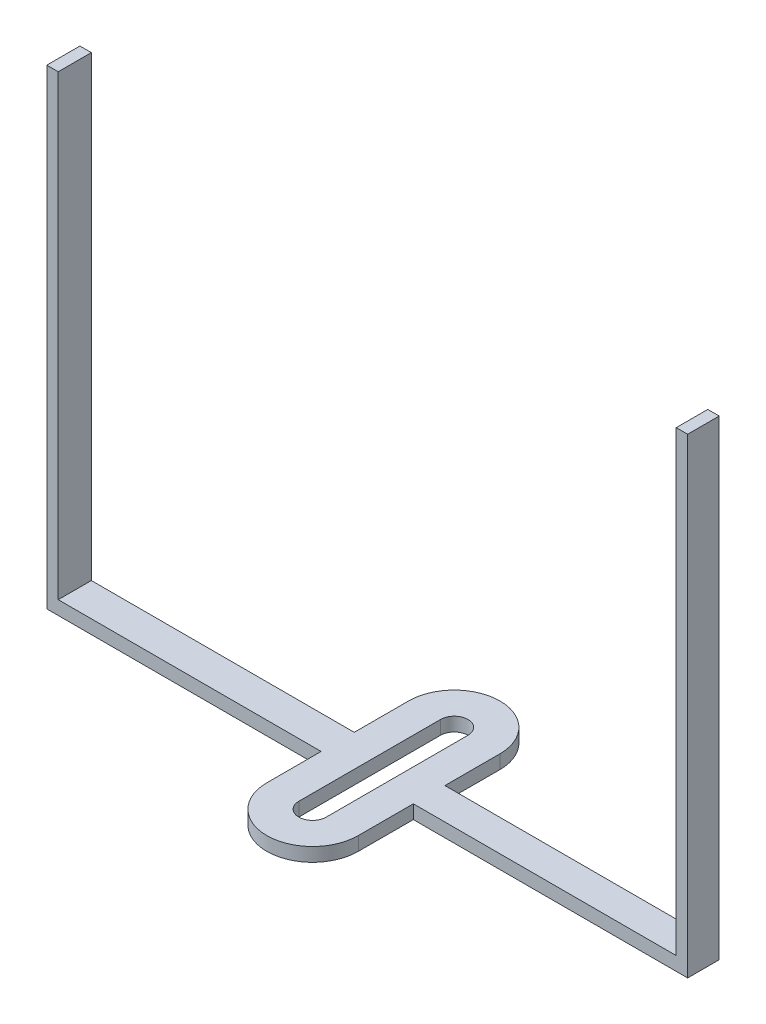
ISO-10303-21;
HEADER;
FILE_DESCRIPTION(('STEP AP214'),'2;1');
FILE_NAME('part.step','',(''),(''),'','','');
FILE_SCHEMA(('AUTOMOTIVE_DESIGN { 1 0 10303 214 1 1 1 1 }'));
ENDSEC;
DATA;
#1=APPLICATION_CONTEXT('core data for automotive mechanical design processes');
#2=APPLICATION_PROTOCOL_DEFINITION('international standard','automotive_design',2000,#1);
#3=PRODUCT_CONTEXT('',#1,'mechanical');
#4=PRODUCT('Part','Part','',(#3));
#5=PRODUCT_RELATED_PRODUCT_CATEGORY('part','',(#4));
#6=PRODUCT_DEFINITION_FORMATION('','',#4);
#7=PRODUCT_DEFINITION_CONTEXT('part definition',#1,'design');
#8=PRODUCT_DEFINITION('design','',#6,#7);
#9=PRODUCT_DEFINITION_SHAPE('','',#8);
#10=(LENGTH_UNIT() NAMED_UNIT(*) SI_UNIT(.MILLI.,.METRE.));
#11=(NAMED_UNIT(*) PLANE_ANGLE_UNIT() SI_UNIT($,.RADIAN.));
#12=(NAMED_UNIT(*) SI_UNIT($,.STERADIAN.) SOLID_ANGLE_UNIT());
#13=UNCERTAINTY_MEASURE_WITH_UNIT(LENGTH_MEASURE(1.E-05),#10,'distance_accuracy_value','');
#14=(GEOMETRIC_REPRESENTATION_CONTEXT(3) GLOBAL_UNCERTAINTY_ASSIGNED_CONTEXT((#13)) GLOBAL_UNIT_ASSIGNED_CONTEXT((#10,
#11,#12)) REPRESENTATION_CONTEXT('',''));
#15=CARTESIAN_POINT('',(0.,0.,0.));
#16=DIRECTION('',(0.,0.,1.));
#17=DIRECTION('',(1.,0.,0.));
#18=AXIS2_PLACEMENT_3D('',#15,#16,#17);
#19=CARTESIAN_POINT('',(0.,3.,-31.));
#20=DIRECTION('',(0.,1.,0.));
#21=DIRECTION('',(0.,0.,1.));
#22=AXIS2_PLACEMENT_3D('',#19,#20,#21);
#23=PLANE('',#22);
#24=DIRECTION('',(0.,0.,-1.));
#25=VECTOR('',#24,1.);
#26=CARTESIAN_POINT('',(2.99999999999999,3.,0.));
#27=LINE('',#26,#25);
#28=CARTESIAN_POINT('',(2.99999999999999,3.,0.));
#29=VERTEX_POINT('',#28);
#30=CARTESIAN_POINT('',(2.99999999999999,3.,-31.));
#31=VERTEX_POINT('',#30);
#32=EDGE_CURVE('E261',#29,#31,#27,.T.);
#33=ORIENTED_EDGE('',*,*,#32,.F.);
#34=CARTESIAN_POINT('',(0.,3.,0.));
#35=DIRECTION('',(0.,1.,0.));
#36=DIRECTION('',(0.,0.,1.));
#37=AXIS2_PLACEMENT_3D('',#34,#35,#36);
#38=CIRCLE('',#37,2.99999999999999);
#39=CARTESIAN_POINT('',(-2.99999999999999,3.,0.));
#40=VERTEX_POINT('',#39);
#41=EDGE_CURVE('E259',#40,#29,#38,.T.);
#42=ORIENTED_EDGE('',*,*,#41,.F.);
#43=DIRECTION('',(0.,0.,1.));
#44=VECTOR('',#43,1.);
#45=CARTESIAN_POINT('',(-2.99999999999999,3.,0.));
#46=LINE('',#45,#44);
#47=CARTESIAN_POINT('',(-2.99999999999999,3.,-31.));
#48=VERTEX_POINT('',#47);
#49=EDGE_CURVE('E267',#48,#40,#46,.T.);
#50=ORIENTED_EDGE('',*,*,#49,.F.);
#51=CARTESIAN_POINT('',(0.,3.,-31.));
#52=DIRECTION('',(0.,1.,0.));
#53=DIRECTION('',(0.,0.,1.));
#54=AXIS2_PLACEMENT_3D('',#51,#52,#53);
#55=CIRCLE('',#54,2.99999999999999);
#56=EDGE_CURVE('E264',#31,#48,#55,.T.);
#57=ORIENTED_EDGE('',*,*,#56,.F.);
#58=EDGE_LOOP('',(#33,#42,#50,#57));
#59=FACE_BOUND('',#58,.T.);
#60=DIRECTION('',(1.,0.,0.));
#61=VECTOR('',#60,1.);
#62=CARTESIAN_POINT('',(-70.,3.,-19.125));
#63=LINE('',#62,#61);
#64=CARTESIAN_POINT('',(-67.5,3.,-19.125));
#65=VERTEX_POINT('',#64);
#66=CARTESIAN_POINT('',(-9.99999999999999,3.,-19.125));
#67=VERTEX_POINT('',#66);
#68=EDGE_CURVE('E233',#65,#67,#63,.T.);
#69=ORIENTED_EDGE('',*,*,#68,.F.);
#70=DIRECTION('',(0.,0.,-1.));
#71=VECTOR('',#70,1.);
#72=CARTESIAN_POINT('',(-67.5,3.,-19.125));
#73=LINE('',#72,#71);
#74=CARTESIAN_POINT('',(-67.5,3.,-11.875));
#75=VERTEX_POINT('',#74);
#76=EDGE_CURVE('E195',#75,#65,#73,.T.);
#77=ORIENTED_EDGE('',*,*,#76,.F.);
#78=DIRECTION('',(1.,0.,0.));
#79=VECTOR('',#78,1.);
#80=CARTESIAN_POINT('',(-70.,3.,-11.875));
#81=LINE('',#80,#79);
#82=CARTESIAN_POINT('',(-9.99999999999999,3.,-11.875));
#83=VERTEX_POINT('',#82);
#84=EDGE_CURVE('E54',#75,#83,#81,.T.);
#85=ORIENTED_EDGE('',*,*,#84,.T.);
#86=DIRECTION('',(0.,0.,1.));
#87=VECTOR('',#86,1.);
#88=CARTESIAN_POINT('',(-9.99999999999999,3.,-31.));
#89=LINE('',#88,#87);
#90=CARTESIAN_POINT('',(-9.99999999999999,3.,0.));
#91=VERTEX_POINT('',#90);
#92=EDGE_CURVE('E293',#83,#91,#89,.T.);
#93=ORIENTED_EDGE('',*,*,#92,.T.);
#94=CARTESIAN_POINT('',(0.,3.,0.));
#95=DIRECTION('',(0.,1.,0.));
#96=DIRECTION('',(0.,0.,1.));
#97=AXIS2_PLACEMENT_3D('',#94,#95,#96);
#98=CIRCLE('',#97,9.99999999999999);
#99=CARTESIAN_POINT('',(9.99999999999999,3.,0.));
#100=VERTEX_POINT('',#99);
#101=EDGE_CURVE('E298',#91,#100,#98,.T.);
#102=ORIENTED_EDGE('',*,*,#101,.T.);
#103=DIRECTION('',(0.,0.,-1.));
#104=VECTOR('',#103,1.);
#105=CARTESIAN_POINT('',(9.99999999999999,3.,-31.));
#106=LINE('',#105,#104);
#107=CARTESIAN_POINT('',(9.99999999999999,3.,-12.0483562662711));
#108=VERTEX_POINT('',#107);
#109=EDGE_CURVE('E301',#100,#108,#106,.T.);
#110=ORIENTED_EDGE('',*,*,#109,.T.);
#111=DIRECTION('',(-1.,0.,0.));
#112=VECTOR('',#111,1.);
#113=CARTESIAN_POINT('',(70.,3.,-12.0483562662711));
#114=LINE('',#113,#112);
#115=CARTESIAN_POINT('',(67.5,3.,-12.0483562662711));
#116=VERTEX_POINT('',#115);
#117=EDGE_CURVE('E254',#116,#108,#114,.T.);
#118=ORIENTED_EDGE('',*,*,#117,.F.);
#119=DIRECTION('',(0.,0.,1.));
#120=VECTOR('',#119,1.);
#121=CARTESIAN_POINT('',(67.5,3.,-18.9516437337289));
#122=LINE('',#121,#120);
#123=CARTESIAN_POINT('',(67.5,3.,-18.9516437337289));
#124=VERTEX_POINT('',#123);
#125=EDGE_CURVE('E47',#124,#116,#122,.T.);
#126=ORIENTED_EDGE('',*,*,#125,.F.);
#127=DIRECTION('',(-1.,0.,0.));
#128=VECTOR('',#127,1.);
#129=CARTESIAN_POINT('',(70.,3.,-18.9516437337289));
#130=LINE('',#129,#128);
#131=CARTESIAN_POINT('',(9.99999999999999,3.,-18.9516437337289));
#132=VERTEX_POINT('',#131);
#133=EDGE_CURVE('E256',#124,#132,#130,.T.);
#134=ORIENTED_EDGE('',*,*,#133,.T.);
#135=CARTESIAN_POINT('',(9.99999999999999,3.,-31.));
#136=VERTEX_POINT('',#135);
#137=EDGE_CURVE('E300',#132,#136,#106,.T.);
#138=ORIENTED_EDGE('',*,*,#137,.T.);
#139=CARTESIAN_POINT('',(0.,3.,-31.));
#140=DIRECTION('',(0.,1.,0.));
#141=DIRECTION('',(0.,0.,1.));
#142=AXIS2_PLACEMENT_3D('',#139,#140,#141);
#143=CIRCLE('',#142,9.99999999999999);
#144=CARTESIAN_POINT('',(-9.99999999999999,3.,-31.));
#145=VERTEX_POINT('',#144);
#146=EDGE_CURVE('E290',#136,#145,#143,.T.);
#147=ORIENTED_EDGE('',*,*,#146,.T.);
#148=EDGE_CURVE('E295',#145,#67,#89,.T.);
#149=ORIENTED_EDGE('',*,*,#148,.T.);
#150=EDGE_LOOP('',(#69,#77,#85,#93,#102,#110,#118,#126,#134,#138,#147,#149));
#151=FACE_BOUND('',#150,.T.);
#152=ADVANCED_FACE('F32',(#59,#151),#23,.T.);
#153=CARTESIAN_POINT('',(-9.99999999999999,3.,-31.));
#154=DIRECTION('',(1.,0.,0.));
#155=DIRECTION('',(0.,0.,-1.));
#156=AXIS2_PLACEMENT_3D('',#153,#154,#155);
#157=PLANE('',#156);
#158=DIRECTION('',(0.,1.,0.));
#159=VECTOR('',#158,1.);
#160=CARTESIAN_POINT('',(-9.99999999999999,0.,-11.875));
#161=LINE('',#160,#159);
#162=CARTESIAN_POINT('',(-9.99999999999999,0.,-11.875));
#163=VERTEX_POINT('',#162);
#164=EDGE_CURVE('E221',#163,#83,#161,.T.);
#165=ORIENTED_EDGE('',*,*,#164,.F.);
#166=DIRECTION('',(0.,0.,1.));
#167=VECTOR('',#166,1.);
#168=CARTESIAN_POINT('',(-9.99999999999999,0.,-31.));
#169=LINE('',#168,#167);
#170=CARTESIAN_POINT('',(-9.99999999999999,0.,0.));
#171=VERTEX_POINT('',#170);
#172=EDGE_CURVE('E307',#163,#171,#169,.T.);
#173=ORIENTED_EDGE('',*,*,#172,.T.);
#174=DIRECTION('',(0.,-1.,0.));
#175=VECTOR('',#174,1.);
#176=CARTESIAN_POINT('',(-9.99999999999999,3.,0.));
#177=LINE('',#176,#175);
#178=EDGE_CURVE('E40',#91,#171,#177,.T.);
#179=ORIENTED_EDGE('',*,*,#178,.F.);
#180=ORIENTED_EDGE('',*,*,#92,.F.);
#181=EDGE_LOOP('',(#165,#173,#179,#180));
#182=FACE_BOUND('',#181,.T.);
#183=ADVANCED_FACE('F365',(#182),#157,.F.);
#184=DIRECTION('',(0.,-1.,0.));
#185=VECTOR('',#184,1.);
#186=CARTESIAN_POINT('',(-9.99999999999999,0.,-19.125));
#187=LINE('',#186,#185);
#188=CARTESIAN_POINT('',(-9.99999999999999,0.,-19.125));
#189=VERTEX_POINT('',#188);
#190=EDGE_CURVE('E180',#67,#189,#187,.T.);
#191=ORIENTED_EDGE('',*,*,#190,.F.);
#192=ORIENTED_EDGE('',*,*,#148,.F.);
#193=DIRECTION('',(0.,-1.,0.));
#194=VECTOR('',#193,1.);
#195=CARTESIAN_POINT('',(-9.99999999999999,3.,-31.));
#196=LINE('',#195,#194);
#197=CARTESIAN_POINT('',(-9.99999999999999,0.,-31.));
#198=VERTEX_POINT('',#197);
#199=EDGE_CURVE('E11',#145,#198,#196,.T.);
#200=ORIENTED_EDGE('',*,*,#199,.T.);
#201=EDGE_CURVE('E308',#198,#189,#169,.T.);
#202=ORIENTED_EDGE('',*,*,#201,.T.);
#203=EDGE_LOOP('',(#191,#192,#200,#202));
#204=FACE_BOUND('',#203,.T.);
#205=ADVANCED_FACE('F361',(#204),#157,.F.);
#206=CARTESIAN_POINT('',(9.99999999999999,3.,-31.));
#207=DIRECTION('',(-1.,0.,0.));
#208=DIRECTION('',(0.,0.,1.));
#209=AXIS2_PLACEMENT_3D('',#206,#207,#208);
#210=PLANE('',#209);
#211=DIRECTION('',(0.,1.,0.));
#212=VECTOR('',#211,1.);
#213=CARTESIAN_POINT('',(9.99999999999999,3.,-18.9516437337289));
#214=LINE('',#213,#212);
#215=CARTESIAN_POINT('',(9.99999999999999,0.,-18.9516437337289));
#216=VERTEX_POINT('',#215);
#217=EDGE_CURVE('E236',#216,#132,#214,.T.);
#218=ORIENTED_EDGE('',*,*,#217,.F.);
#219=DIRECTION('',(0.,0.,-1.));
#220=VECTOR('',#219,1.);
#221=CARTESIAN_POINT('',(9.99999999999999,0.,-31.));
#222=LINE('',#221,#220);
#223=CARTESIAN_POINT('',(9.99999999999999,0.,-31.));
#224=VERTEX_POINT('',#223);
#225=EDGE_CURVE('E312',#216,#224,#222,.T.);
#226=ORIENTED_EDGE('',*,*,#225,.T.);
#227=DIRECTION('',(0.,-1.,0.));
#228=VECTOR('',#227,1.);
#229=CARTESIAN_POINT('',(9.99999999999999,3.,-31.));
#230=LINE('',#229,#228);
#231=EDGE_CURVE('E304',#136,#224,#230,.T.);
#232=ORIENTED_EDGE('',*,*,#231,.F.);
#233=ORIENTED_EDGE('',*,*,#137,.F.);
#234=EDGE_LOOP('',(#218,#226,#232,#233));
#235=FACE_BOUND('',#234,.T.);
#236=ADVANCED_FACE('F355',(#235),#210,.F.);
#237=DIRECTION('',(0.,-1.,0.));
#238=VECTOR('',#237,1.);
#239=CARTESIAN_POINT('',(9.99999999999999,3.,-12.0483562662711));
#240=LINE('',#239,#238);
#241=CARTESIAN_POINT('',(9.99999999999999,0.,-12.0483562662711));
#242=VERTEX_POINT('',#241);
#243=EDGE_CURVE('E240',#108,#242,#240,.T.);
#244=ORIENTED_EDGE('',*,*,#243,.F.);
#245=ORIENTED_EDGE('',*,*,#109,.F.);
#246=DIRECTION('',(0.,-1.,0.));
#247=VECTOR('',#246,1.);
#248=CARTESIAN_POINT('',(9.99999999999999,3.,0.));
#249=LINE('',#248,#247);
#250=CARTESIAN_POINT('',(9.99999999999999,0.,0.));
#251=VERTEX_POINT('',#250);
#252=EDGE_CURVE('E316',#100,#251,#249,.T.);
#253=ORIENTED_EDGE('',*,*,#252,.T.);
#254=EDGE_CURVE('E294',#251,#242,#222,.T.);
#255=ORIENTED_EDGE('',*,*,#254,.T.);
#256=EDGE_LOOP('',(#244,#245,#253,#255));
#257=FACE_BOUND('',#256,.T.);
#258=ADVANCED_FACE('F336',(#257),#210,.F.);
#259=CARTESIAN_POINT('',(0.,0.,-31.));
#260=DIRECTION('',(0.,1.,0.));
#261=DIRECTION('',(0.,0.,1.));
#262=AXIS2_PLACEMENT_3D('',#259,#260,#261);
#263=PLANE('',#262);
#264=CARTESIAN_POINT('',(0.,0.,-31.));
#265=DIRECTION('',(0.,1.,0.));
#266=DIRECTION('',(0.,0.,1.));
#267=AXIS2_PLACEMENT_3D('',#264,#265,#266);
#268=CIRCLE('',#267,9.99999999999999);
#269=EDGE_CURVE('E289',#224,#198,#268,.T.);
#270=ORIENTED_EDGE('',*,*,#269,.F.);
#271=ORIENTED_EDGE('',*,*,#225,.F.);
#272=DIRECTION('',(-1.,0.,0.));
#273=VECTOR('',#272,1.);
#274=CARTESIAN_POINT('',(70.,0.,-18.9516437337289));
#275=LINE('',#274,#273);
#276=CARTESIAN_POINT('',(70.,0.,-18.9516437337289));
#277=VERTEX_POINT('',#276);
#278=EDGE_CURVE('E244',#277,#216,#275,.T.);
#279=ORIENTED_EDGE('',*,*,#278,.F.);
#280=DIRECTION('',(0.,0.,-1.));
#281=VECTOR('',#280,1.);
#282=CARTESIAN_POINT('',(70.,0.,-18.9516437337289));
#283=LINE('',#282,#281);
#284=CARTESIAN_POINT('',(70.,0.,-12.0483562662711));
#285=VERTEX_POINT('',#284);
#286=EDGE_CURVE('E242',#285,#277,#283,.T.);
#287=ORIENTED_EDGE('',*,*,#286,.F.);
#288=DIRECTION('',(-1.,0.,0.));
#289=VECTOR('',#288,1.);
#290=CARTESIAN_POINT('',(70.,0.,-12.0483562662711));
#291=LINE('',#290,#289);
#292=EDGE_CURVE('E251',#285,#242,#291,.T.);
#293=ORIENTED_EDGE('',*,*,#292,.T.);
#294=ORIENTED_EDGE('',*,*,#254,.F.);
#295=CARTESIAN_POINT('',(0.,0.,0.));
#296=DIRECTION('',(0.,1.,0.));
#297=DIRECTION('',(0.,0.,1.));
#298=AXIS2_PLACEMENT_3D('',#295,#296,#297);
#299=CIRCLE('',#298,9.99999999999999);
#300=EDGE_CURVE('E310',#171,#251,#299,.T.);
#301=ORIENTED_EDGE('',*,*,#300,.F.);
#302=ORIENTED_EDGE('',*,*,#172,.F.);
#303=DIRECTION('',(1.,0.,0.));
#304=VECTOR('',#303,1.);
#305=CARTESIAN_POINT('',(-70.,0.,-11.875));
#306=LINE('',#305,#304);
#307=CARTESIAN_POINT('',(-70.,0.,-11.875));
#308=VERTEX_POINT('',#307);
#309=EDGE_CURVE('E225',#308,#163,#306,.T.);
#310=ORIENTED_EDGE('',*,*,#309,.F.);
#311=DIRECTION('',(0.,0.,1.));
#312=VECTOR('',#311,1.);
#313=CARTESIAN_POINT('',(-70.,0.,-11.875));
#314=LINE('',#313,#312);
#315=CARTESIAN_POINT('',(-70.,0.,-19.125));
#316=VERTEX_POINT('',#315);
#317=EDGE_CURVE('E175',#316,#308,#314,.T.);
#318=ORIENTED_EDGE('',*,*,#317,.F.);
#319=DIRECTION('',(1.,0.,0.));
#320=VECTOR('',#319,1.);
#321=CARTESIAN_POINT('',(-70.,0.,-19.125));
#322=LINE('',#321,#320);
#323=EDGE_CURVE('E230',#316,#189,#322,.T.);
#324=ORIENTED_EDGE('',*,*,#323,.T.);
#325=ORIENTED_EDGE('',*,*,#201,.F.);
#326=EDGE_LOOP('',(#270,#271,#279,#287,#293,#294,#301,#302,#310,#318,#324,#325));
#327=FACE_BOUND('',#326,.T.);
#328=CARTESIAN_POINT('',(0.,0.,0.));
#329=DIRECTION('',(0.,1.,0.));
#330=DIRECTION('',(0.,0.,1.));
#331=AXIS2_PLACEMENT_3D('',#328,#329,#330);
#332=CIRCLE('',#331,2.99999999999999);
#333=CARTESIAN_POINT('',(-2.99999999999999,0.,0.));
#334=VERTEX_POINT('',#333);
#335=CARTESIAN_POINT('',(2.99999999999999,0.,0.));
#336=VERTEX_POINT('',#335);
#337=EDGE_CURVE('E258',#334,#336,#332,.T.);
#338=ORIENTED_EDGE('',*,*,#337,.T.);
#339=DIRECTION('',(0.,0.,-1.));
#340=VECTOR('',#339,1.);
#341=CARTESIAN_POINT('',(2.99999999999999,0.,0.));
#342=LINE('',#341,#340);
#343=CARTESIAN_POINT('',(2.99999999999999,0.,-31.));
#344=VERTEX_POINT('',#343);
#345=EDGE_CURVE('E272',#336,#344,#342,.T.);
#346=ORIENTED_EDGE('',*,*,#345,.T.);
#347=CARTESIAN_POINT('',(0.,0.,-31.));
#348=DIRECTION('',(0.,1.,0.));
#349=DIRECTION('',(0.,0.,1.));
#350=AXIS2_PLACEMENT_3D('',#347,#348,#349);
#351=CIRCLE('',#350,2.99999999999999);
#352=CARTESIAN_POINT('',(-2.99999999999999,0.,-31.));
#353=VERTEX_POINT('',#352);
#354=EDGE_CURVE('E275',#344,#353,#351,.T.);
#355=ORIENTED_EDGE('',*,*,#354,.T.);
#356=DIRECTION('',(0.,0.,1.));
#357=VECTOR('',#356,1.);
#358=CARTESIAN_POINT('',(-2.99999999999999,0.,0.));
#359=LINE('',#358,#357);
#360=EDGE_CURVE('E262',#353,#334,#359,.T.);
#361=ORIENTED_EDGE('',*,*,#360,.T.);
#362=EDGE_LOOP('',(#338,#346,#355,#361));
#363=FACE_BOUND('',#362,.T.);
#364=ADVANCED_FACE('F329',(#327,#363),#263,.F.);
#365=CARTESIAN_POINT('',(0.,3.,-31.));
#366=DIRECTION('',(0.,-1.,0.));
#367=DIRECTION('',(0.,0.,-1.));
#368=AXIS2_PLACEMENT_3D('',#365,#366,#367);
#369=CYLINDRICAL_SURFACE('',#368,9.99999999999999);
#370=ORIENTED_EDGE('',*,*,#269,.T.);
#371=ORIENTED_EDGE('',*,*,#199,.F.);
#372=ORIENTED_EDGE('',*,*,#146,.F.);
#373=ORIENTED_EDGE('',*,*,#231,.T.);
#374=EDGE_LOOP('',(#370,#371,#372,#373));
#375=FACE_BOUND('',#374,.T.);
#376=ADVANCED_FACE('F34',(#375),#369,.T.);
#377=CARTESIAN_POINT('',(0.,3.,0.));
#378=DIRECTION('',(0.,-1.,0.));
#379=DIRECTION('',(0.,0.,-1.));
#380=AXIS2_PLACEMENT_3D('',#377,#378,#379);
#381=CYLINDRICAL_SURFACE('',#380,9.99999999999999);
#382=ORIENTED_EDGE('',*,*,#300,.T.);
#383=ORIENTED_EDGE('',*,*,#252,.F.);
#384=ORIENTED_EDGE('',*,*,#101,.F.);
#385=ORIENTED_EDGE('',*,*,#178,.T.);
#386=EDGE_LOOP('',(#382,#383,#384,#385));
#387=FACE_BOUND('',#386,.T.);
#388=ADVANCED_FACE('F323',(#387),#381,.T.);
#389=CARTESIAN_POINT('',(0.,3.,0.));
#390=DIRECTION('',(0.,-1.,0.));
#391=DIRECTION('',(0.,0.,-1.));
#392=AXIS2_PLACEMENT_3D('',#389,#390,#391);
#393=CYLINDRICAL_SURFACE('',#392,2.99999999999999);
#394=ORIENTED_EDGE('',*,*,#337,.F.);
#395=DIRECTION('',(0.,-1.,0.));
#396=VECTOR('',#395,1.);
#397=CARTESIAN_POINT('',(-2.99999999999999,3.,0.));
#398=LINE('',#397,#396);
#399=EDGE_CURVE('E269',#40,#334,#398,.T.);
#400=ORIENTED_EDGE('',*,*,#399,.F.);
#401=ORIENTED_EDGE('',*,*,#41,.T.);
#402=DIRECTION('',(0.,-1.,0.));
#403=VECTOR('',#402,1.);
#404=CARTESIAN_POINT('',(2.99999999999999,3.,0.));
#405=LINE('',#404,#403);
#406=EDGE_CURVE('E286',#29,#336,#405,.T.);
#407=ORIENTED_EDGE('',*,*,#406,.T.);
#408=EDGE_LOOP('',(#394,#400,#401,#407));
#409=FACE_BOUND('',#408,.T.);
#410=ADVANCED_FACE('F377',(#409),#393,.F.);
#411=CARTESIAN_POINT('',(2.99999999999999,3.,0.));
#412=DIRECTION('',(-1.,0.,0.));
#413=DIRECTION('',(0.,0.,1.));
#414=AXIS2_PLACEMENT_3D('',#411,#412,#413);
#415=PLANE('',#414);
#416=ORIENTED_EDGE('',*,*,#345,.F.);
#417=ORIENTED_EDGE('',*,*,#406,.F.);
#418=ORIENTED_EDGE('',*,*,#32,.T.);
#419=DIRECTION('',(0.,-1.,0.));
#420=VECTOR('',#419,1.);
#421=CARTESIAN_POINT('',(2.99999999999999,3.,-31.));
#422=LINE('',#421,#420);
#423=EDGE_CURVE('E284',#31,#344,#422,.T.);
#424=ORIENTED_EDGE('',*,*,#423,.T.);
#425=EDGE_LOOP('',(#416,#417,#418,#424));
#426=FACE_BOUND('',#425,.T.);
#427=ADVANCED_FACE('F384',(#426),#415,.T.);
#428=CARTESIAN_POINT('',(0.,3.,-31.));
#429=DIRECTION('',(0.,-1.,0.));
#430=DIRECTION('',(0.,0.,-1.));
#431=AXIS2_PLACEMENT_3D('',#428,#429,#430);
#432=CYLINDRICAL_SURFACE('',#431,2.99999999999999);
#433=ORIENTED_EDGE('',*,*,#354,.F.);
#434=ORIENTED_EDGE('',*,*,#423,.F.);
#435=ORIENTED_EDGE('',*,*,#56,.T.);
#436=DIRECTION('',(0.,-1.,0.));
#437=VECTOR('',#436,1.);
#438=CARTESIAN_POINT('',(-2.99999999999999,3.,-31.));
#439=LINE('',#438,#437);
#440=EDGE_CURVE('E282',#48,#353,#439,.T.);
#441=ORIENTED_EDGE('',*,*,#440,.T.);
#442=EDGE_LOOP('',(#433,#434,#435,#441));
#443=FACE_BOUND('',#442,.T.);
#444=ADVANCED_FACE('F388',(#443),#432,.F.);
#445=CARTESIAN_POINT('',(-2.99999999999999,3.,0.));
#446=DIRECTION('',(1.,0.,0.));
#447=DIRECTION('',(0.,0.,-1.));
#448=AXIS2_PLACEMENT_3D('',#445,#446,#447);
#449=PLANE('',#448);
#450=ORIENTED_EDGE('',*,*,#360,.F.);
#451=ORIENTED_EDGE('',*,*,#440,.F.);
#452=ORIENTED_EDGE('',*,*,#49,.T.);
#453=ORIENTED_EDGE('',*,*,#399,.T.);
#454=EDGE_LOOP('',(#450,#451,#452,#453));
#455=FACE_BOUND('',#454,.T.);
#456=ADVANCED_FACE('F392',(#455),#449,.T.);
#457=CARTESIAN_POINT('',(70.,3.,-18.9516437337289));
#458=DIRECTION('',(0.,0.,1.));
#459=DIRECTION('',(1.,0.,0.));
#460=AXIS2_PLACEMENT_3D('',#457,#458,#459);
#461=PLANE('',#460);
#462=ORIENTED_EDGE('',*,*,#217,.T.);
#463=ORIENTED_EDGE('',*,*,#133,.F.);
#464=DIRECTION('',(0.,-1.,0.));
#465=VECTOR('',#464,1.);
#466=CARTESIAN_POINT('',(67.5,103.,-18.9516437337289));
#467=LINE('',#466,#465);
#468=CARTESIAN_POINT('',(67.5,103.,-18.9516437337289));
#469=VERTEX_POINT('',#468);
#470=EDGE_CURVE('E219',#469,#124,#467,.T.);
#471=ORIENTED_EDGE('',*,*,#470,.F.);
#472=DIRECTION('',(-1.,0.,0.));
#473=VECTOR('',#472,1.);
#474=CARTESIAN_POINT('',(70.,103.,-18.9516437337289));
#475=LINE('',#474,#473);
#476=CARTESIAN_POINT('',(70.,103.,-18.9516437337289));
#477=VERTEX_POINT('',#476);
#478=EDGE_CURVE('E208',#477,#469,#475,.T.);
#479=ORIENTED_EDGE('',*,*,#478,.F.);
#480=DIRECTION('',(0.,1.,0.));
#481=VECTOR('',#480,1.);
#482=CARTESIAN_POINT('',(70.,3.,-18.9516437337289));
#483=LINE('',#482,#481);
#484=EDGE_CURVE('E237',#277,#477,#483,.T.);
#485=ORIENTED_EDGE('',*,*,#484,.F.);
#486=ORIENTED_EDGE('',*,*,#278,.T.);
#487=EDGE_LOOP('',(#462,#463,#471,#479,#485,#486));
#488=FACE_BOUND('',#487,.T.);
#489=ADVANCED_FACE('F349',(#488),#461,.F.);
#490=CARTESIAN_POINT('',(70.,3.,-12.0483562662711));
#491=DIRECTION('',(0.,0.,-1.));
#492=DIRECTION('',(0.,1.,0.));
#493=AXIS2_PLACEMENT_3D('',#490,#491,#492);
#494=PLANE('',#493);
#495=ORIENTED_EDGE('',*,*,#243,.T.);
#496=ORIENTED_EDGE('',*,*,#292,.F.);
#497=DIRECTION('',(0.,-1.,0.));
#498=VECTOR('',#497,1.);
#499=CARTESIAN_POINT('',(70.,3.,-12.0483562662711));
#500=LINE('',#499,#498);
#501=CARTESIAN_POINT('',(70.,103.,-12.0483562662711));
#502=VERTEX_POINT('',#501);
#503=EDGE_CURVE('E239',#502,#285,#500,.T.);
#504=ORIENTED_EDGE('',*,*,#503,.F.);
#505=DIRECTION('',(1.,0.,0.));
#506=VECTOR('',#505,1.);
#507=CARTESIAN_POINT('',(70.,103.,-12.0483562662711));
#508=LINE('',#507,#506);
#509=CARTESIAN_POINT('',(67.5,103.,-12.0483562662711));
#510=VERTEX_POINT('',#509);
#511=EDGE_CURVE('E212',#510,#502,#508,.T.);
#512=ORIENTED_EDGE('',*,*,#511,.F.);
#513=DIRECTION('',(0.,-1.,0.));
#514=VECTOR('',#513,1.);
#515=CARTESIAN_POINT('',(67.5,103.,-12.0483562662711));
#516=LINE('',#515,#514);
#517=EDGE_CURVE('E215',#510,#116,#516,.T.);
#518=ORIENTED_EDGE('',*,*,#517,.T.);
#519=ORIENTED_EDGE('',*,*,#117,.T.);
#520=EDGE_LOOP('',(#495,#496,#504,#512,#518,#519));
#521=FACE_BOUND('',#520,.T.);
#522=ADVANCED_FACE('F339',(#521),#494,.F.);
#523=CARTESIAN_POINT('',(70.,0.,0.));
#524=DIRECTION('',(-1.,0.,0.));
#525=DIRECTION('',(0.,0.,1.));
#526=AXIS2_PLACEMENT_3D('',#523,#524,#525);
#527=PLANE('',#526);
#528=ORIENTED_EDGE('',*,*,#484,.T.);
#529=DIRECTION('',(0.,0.,-1.));
#530=VECTOR('',#529,1.);
#531=CARTESIAN_POINT('',(70.,103.,-18.9516437337289));
#532=LINE('',#531,#530);
#533=EDGE_CURVE('E205',#502,#477,#532,.T.);
#534=ORIENTED_EDGE('',*,*,#533,.F.);
#535=ORIENTED_EDGE('',*,*,#503,.T.);
#536=ORIENTED_EDGE('',*,*,#286,.T.);
#537=EDGE_LOOP('',(#528,#534,#535,#536));
#538=FACE_BOUND('',#537,.T.);
#539=ADVANCED_FACE('F401',(#538),#527,.F.);
#540=CARTESIAN_POINT('',(-70.,0.,-11.875));
#541=DIRECTION('',(0.,0.,-1.));
#542=DIRECTION('',(-1.,0.,0.));
#543=AXIS2_PLACEMENT_3D('',#540,#541,#542);
#544=PLANE('',#543);
#545=ORIENTED_EDGE('',*,*,#164,.T.);
#546=ORIENTED_EDGE('',*,*,#84,.F.);
#547=DIRECTION('',(0.,-1.,0.));
#548=VECTOR('',#547,1.);
#549=CARTESIAN_POINT('',(-67.5,103.,-11.875));
#550=LINE('',#549,#548);
#551=CARTESIAN_POINT('',(-67.5,103.,-11.875));
#552=VERTEX_POINT('',#551);
#553=EDGE_CURVE('E186',#552,#75,#550,.T.);
#554=ORIENTED_EDGE('',*,*,#553,.F.);
#555=DIRECTION('',(1.,0.,0.));
#556=VECTOR('',#555,1.);
#557=CARTESIAN_POINT('',(-70.,103.,-11.875));
#558=LINE('',#557,#556);
#559=CARTESIAN_POINT('',(-70.,103.,-11.875));
#560=VERTEX_POINT('',#559);
#561=EDGE_CURVE('E183',#560,#552,#558,.T.);
#562=ORIENTED_EDGE('',*,*,#561,.F.);
#563=DIRECTION('',(0.,1.,0.));
#564=VECTOR('',#563,1.);
#565=CARTESIAN_POINT('',(-70.,0.,-11.875));
#566=LINE('',#565,#564);
#567=EDGE_CURVE('E169',#308,#560,#566,.T.);
#568=ORIENTED_EDGE('',*,*,#567,.F.);
#569=ORIENTED_EDGE('',*,*,#309,.T.);
#570=EDGE_LOOP('',(#545,#546,#554,#562,#568,#569));
#571=FACE_BOUND('',#570,.T.);
#572=ADVANCED_FACE('F185',(#571),#544,.F.);
#573=CARTESIAN_POINT('',(-70.,0.,-19.125));
#574=DIRECTION('',(0.,0.,1.));
#575=DIRECTION('',(1.,0.,0.));
#576=AXIS2_PLACEMENT_3D('',#573,#574,#575);
#577=PLANE('',#576);
#578=ORIENTED_EDGE('',*,*,#190,.T.);
#579=ORIENTED_EDGE('',*,*,#323,.F.);
#580=DIRECTION('',(0.,-1.,0.));
#581=VECTOR('',#580,1.);
#582=CARTESIAN_POINT('',(-70.,0.,-19.125));
#583=LINE('',#582,#581);
#584=CARTESIAN_POINT('',(-70.,103.,-19.125));
#585=VERTEX_POINT('',#584);
#586=EDGE_CURVE('E179',#585,#316,#583,.T.);
#587=ORIENTED_EDGE('',*,*,#586,.F.);
#588=DIRECTION('',(-1.,0.,0.));
#589=VECTOR('',#588,1.);
#590=CARTESIAN_POINT('',(-70.,103.,-19.125));
#591=LINE('',#590,#589);
#592=CARTESIAN_POINT('',(-67.5,103.,-19.125));
#593=VERTEX_POINT('',#592);
#594=EDGE_CURVE('E194',#593,#585,#591,.T.);
#595=ORIENTED_EDGE('',*,*,#594,.F.);
#596=DIRECTION('',(0.,-1.,0.));
#597=VECTOR('',#596,1.);
#598=CARTESIAN_POINT('',(-67.5,103.,-19.125));
#599=LINE('',#598,#597);
#600=EDGE_CURVE('E200',#593,#65,#599,.T.);
#601=ORIENTED_EDGE('',*,*,#600,.T.);
#602=ORIENTED_EDGE('',*,*,#68,.T.);
#603=EDGE_LOOP('',(#578,#579,#587,#595,#601,#602));
#604=FACE_BOUND('',#603,.T.);
#605=ADVANCED_FACE('F364',(#604),#577,.F.);
#606=CARTESIAN_POINT('',(-70.,0.,0.));
#607=DIRECTION('',(-1.,0.,0.));
#608=DIRECTION('',(0.,0.,1.));
#609=AXIS2_PLACEMENT_3D('',#606,#607,#608);
#610=PLANE('',#609);
#611=ORIENTED_EDGE('',*,*,#567,.T.);
#612=DIRECTION('',(0.,0.,1.));
#613=VECTOR('',#612,1.);
#614=CARTESIAN_POINT('',(-70.,103.,-19.125));
#615=LINE('',#614,#613);
#616=EDGE_CURVE('E173',#585,#560,#615,.T.);
#617=ORIENTED_EDGE('',*,*,#616,.F.);
#618=ORIENTED_EDGE('',*,*,#586,.T.);
#619=ORIENTED_EDGE('',*,*,#317,.T.);
#620=EDGE_LOOP('',(#611,#617,#618,#619));
#621=FACE_BOUND('',#620,.T.);
#622=ADVANCED_FACE('F171',(#621),#610,.T.);
#623=CARTESIAN_POINT('',(67.5,103.,-18.9516437337289));
#624=DIRECTION('',(1.,0.,0.));
#625=DIRECTION('',(0.,0.,-1.));
#626=AXIS2_PLACEMENT_3D('',#623,#624,#625);
#627=PLANE('',#626);
#628=ORIENTED_EDGE('',*,*,#125,.T.);
#629=ORIENTED_EDGE('',*,*,#517,.F.);
#630=DIRECTION('',(0.,0.,1.));
#631=VECTOR('',#630,1.);
#632=CARTESIAN_POINT('',(67.5,103.,-18.9516437337289));
#633=LINE('',#632,#631);
#634=EDGE_CURVE('E210',#469,#510,#633,.T.);
#635=ORIENTED_EDGE('',*,*,#634,.F.);
#636=ORIENTED_EDGE('',*,*,#470,.T.);
#637=EDGE_LOOP('',(#628,#629,#635,#636));
#638=FACE_BOUND('',#637,.T.);
#639=ADVANCED_FACE('F344',(#638),#627,.F.);
#640=CARTESIAN_POINT('',(0.,103.,0.));
#641=DIRECTION('',(0.,-1.,0.));
#642=DIRECTION('',(0.,0.,-1.));
#643=AXIS2_PLACEMENT_3D('',#640,#641,#642);
#644=PLANE('',#643);
#645=ORIENTED_EDGE('',*,*,#533,.T.);
#646=ORIENTED_EDGE('',*,*,#478,.T.);
#647=ORIENTED_EDGE('',*,*,#634,.T.);
#648=ORIENTED_EDGE('',*,*,#511,.T.);
#649=EDGE_LOOP('',(#645,#646,#647,#648));
#650=FACE_BOUND('',#649,.T.);
#651=ADVANCED_FACE('F413',(#650),#644,.F.);
#652=CARTESIAN_POINT('',(-67.5,103.,-19.125));
#653=DIRECTION('',(-1.,0.,0.));
#654=DIRECTION('',(0.,0.,1.));
#655=AXIS2_PLACEMENT_3D('',#652,#653,#654);
#656=PLANE('',#655);
#657=ORIENTED_EDGE('',*,*,#76,.T.);
#658=ORIENTED_EDGE('',*,*,#600,.F.);
#659=DIRECTION('',(0.,0.,-1.));
#660=VECTOR('',#659,1.);
#661=CARTESIAN_POINT('',(-67.5,103.,-19.125));
#662=LINE('',#661,#660);
#663=EDGE_CURVE('E189',#552,#593,#662,.T.);
#664=ORIENTED_EDGE('',*,*,#663,.F.);
#665=ORIENTED_EDGE('',*,*,#553,.T.);
#666=EDGE_LOOP('',(#657,#658,#664,#665));
#667=FACE_BOUND('',#666,.T.);
#668=ADVANCED_FACE('F416',(#667),#656,.F.);
#669=CARTESIAN_POINT('',(0.,103.,0.));
#670=DIRECTION('',(0.,1.,0.));
#671=DIRECTION('',(0.,0.,1.));
#672=AXIS2_PLACEMENT_3D('',#669,#670,#671);
#673=PLANE('',#672);
#674=ORIENTED_EDGE('',*,*,#616,.T.);
#675=ORIENTED_EDGE('',*,*,#561,.T.);
#676=ORIENTED_EDGE('',*,*,#663,.T.);
#677=ORIENTED_EDGE('',*,*,#594,.T.);
#678=EDGE_LOOP('',(#674,#675,#676,#677));
#679=FACE_BOUND('',#678,.T.);
#680=ADVANCED_FACE('F192',(#679),#673,.T.);
#681=CLOSED_SHELL('',(#152,#183,#205,#236,#258,#364,#376,#388,#410,#427,#444,#456,#489,#522,
#539,#572,#605,#622,#639,#651,#668,#680));
#682=MANIFOLD_SOLID_BREP('B2',#681);
#683=ADVANCED_BREP_SHAPE_REPRESENTATION('',(#18,#682),#14);
#684=SHAPE_DEFINITION_REPRESENTATION(#9,#683);
ENDSEC;
END-ISO-10303-21;
